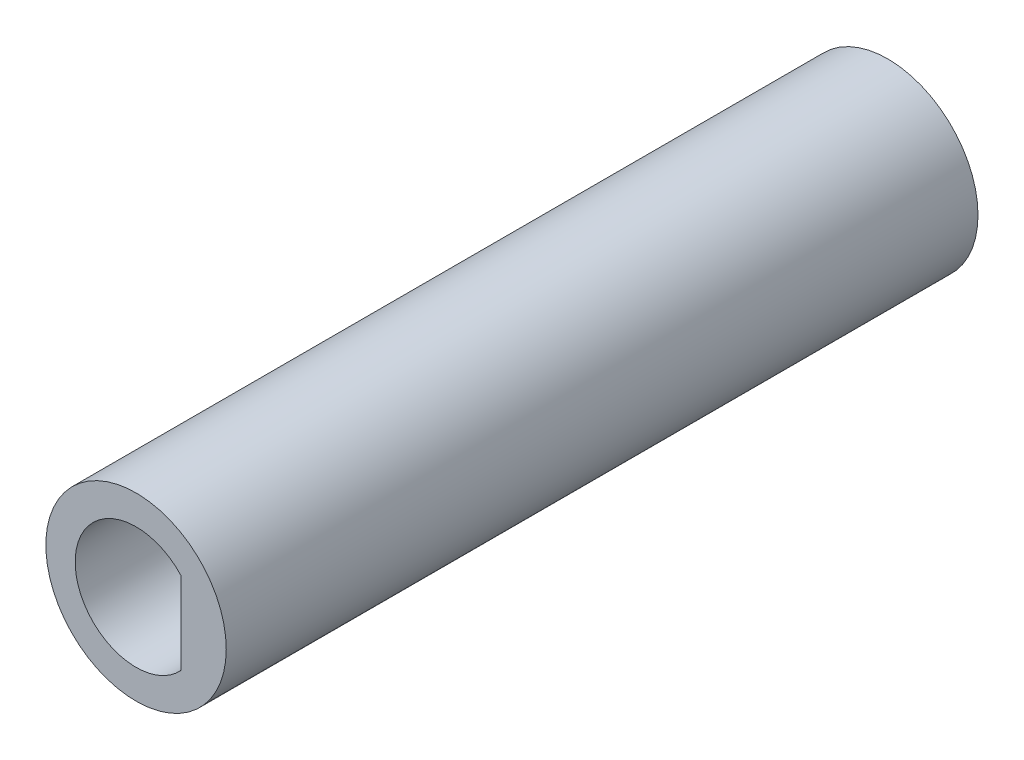
ISO-10303-21;
HEADER;
FILE_DESCRIPTION(('STEP AP214'),'2;1');
FILE_NAME('part.step','',(''),(''),'','','');
FILE_SCHEMA(('AUTOMOTIVE_DESIGN { 1 0 10303 214 1 1 1 1 }'));
ENDSEC;
DATA;
#1=APPLICATION_CONTEXT('core data for automotive mechanical design processes');
#2=APPLICATION_PROTOCOL_DEFINITION('international standard','automotive_design',2000,#1);
#3=PRODUCT_CONTEXT('',#1,'mechanical');
#4=PRODUCT('Part','Part','',(#3));
#5=PRODUCT_RELATED_PRODUCT_CATEGORY('part','',(#4));
#6=PRODUCT_DEFINITION_FORMATION('','',#4);
#7=PRODUCT_DEFINITION_CONTEXT('part definition',#1,'design');
#8=PRODUCT_DEFINITION('design','',#6,#7);
#9=PRODUCT_DEFINITION_SHAPE('','',#8);
#10=(LENGTH_UNIT() NAMED_UNIT(*) SI_UNIT(.MILLI.,.METRE.));
#11=(NAMED_UNIT(*) PLANE_ANGLE_UNIT() SI_UNIT($,.RADIAN.));
#12=(NAMED_UNIT(*) SI_UNIT($,.STERADIAN.) SOLID_ANGLE_UNIT());
#13=UNCERTAINTY_MEASURE_WITH_UNIT(LENGTH_MEASURE(1.E-05),#10,'distance_accuracy_value','');
#14=(GEOMETRIC_REPRESENTATION_CONTEXT(3) GLOBAL_UNCERTAINTY_ASSIGNED_CONTEXT((#13)) GLOBAL_UNIT_ASSIGNED_CONTEXT((#10,
#11,#12)) REPRESENTATION_CONTEXT('',''));
#15=CARTESIAN_POINT('',(0.,0.,0.));
#16=DIRECTION('',(0.,0.,1.));
#17=DIRECTION('',(1.,0.,0.));
#18=AXIS2_PLACEMENT_3D('',#15,#16,#17);
#19=CARTESIAN_POINT('',(0.,0.,15.));
#20=DIRECTION('',(0.,0.,1.));
#21=DIRECTION('',(1.,0.,0.));
#22=AXIS2_PLACEMENT_3D('',#19,#20,#21);
#23=PLANE('',#22);
#24=CARTESIAN_POINT('',(0.,0.,15.));
#25=DIRECTION('',(0.,0.,1.));
#26=DIRECTION('',(1.,0.,0.));
#27=AXIS2_PLACEMENT_3D('',#24,#25,#26);
#28=CIRCLE('',#27,6.);
#29=CARTESIAN_POINT('',(6.,0.,15.));
#30=VERTEX_POINT('',#29);
#31=EDGE_CURVE('E11',#30,#30,#28,.T.);
#32=ORIENTED_EDGE('',*,*,#31,.T.);
#33=EDGE_LOOP('',(#32));
#34=FACE_BOUND('',#33,.T.);
#35=DIRECTION('',(0.,1.,0.));
#36=VECTOR('',#35,1.);
#37=CARTESIAN_POINT('',(3.,2.72075357208256,15.));
#38=LINE('',#37,#36);
#39=CARTESIAN_POINT('',(3.,-2.72075357208256,15.));
#40=VERTEX_POINT('',#39);
#41=CARTESIAN_POINT('',(3.,2.72075357208256,15.));
#42=VERTEX_POINT('',#41);
#43=EDGE_CURVE('E63',#40,#42,#38,.T.);
#44=ORIENTED_EDGE('',*,*,#43,.F.);
#45=CARTESIAN_POINT('',(0.,0.,15.));
#46=DIRECTION('',(0.,0.,1.));
#47=DIRECTION('',(1.,0.,0.));
#48=AXIS2_PLACEMENT_3D('',#45,#46,#47);
#49=CIRCLE('',#48,4.05);
#50=EDGE_CURVE('E85',#42,#40,#49,.T.);
#51=ORIENTED_EDGE('',*,*,#50,.F.);
#52=EDGE_LOOP('',(#44,#51));
#53=FACE_BOUND('',#52,.T.);
#54=ADVANCED_FACE('F42',(#34,#53),#23,.T.);
#55=CARTESIAN_POINT('',(0.,0.,15.));
#56=DIRECTION('',(0.,0.,-1.));
#57=DIRECTION('',(-1.,0.,0.));
#58=AXIS2_PLACEMENT_3D('',#55,#56,#57);
#59=CYLINDRICAL_SURFACE('',#58,6.);
#60=ORIENTED_EDGE('',*,*,#31,.F.);
#61=EDGE_LOOP('',(#60));
#62=FACE_BOUND('',#61,.T.);
#63=CARTESIAN_POINT('',(0.,0.,-35.));
#64=DIRECTION('',(0.,0.,1.));
#65=DIRECTION('',(1.,0.,0.));
#66=AXIS2_PLACEMENT_3D('',#63,#64,#65);
#67=CIRCLE('',#66,6.);
#68=CARTESIAN_POINT('',(6.,0.,-35.));
#69=VERTEX_POINT('',#68);
#70=EDGE_CURVE('E81',#69,#69,#67,.T.);
#71=ORIENTED_EDGE('',*,*,#70,.T.);
#72=EDGE_LOOP('',(#71));
#73=FACE_BOUND('',#72,.T.);
#74=ADVANCED_FACE('F44',(#62,#73),#59,.T.);
#75=CARTESIAN_POINT('',(0.,0.,15.));
#76=DIRECTION('',(0.,0.,-1.));
#77=DIRECTION('',(-1.,0.,0.));
#78=AXIS2_PLACEMENT_3D('',#75,#76,#77);
#79=CYLINDRICAL_SURFACE('',#78,4.05);
#80=CARTESIAN_POINT('',(0.,0.,0.));
#81=DIRECTION('',(0.,0.,1.));
#82=DIRECTION('',(1.,0.,0.));
#83=AXIS2_PLACEMENT_3D('',#80,#81,#82);
#84=CIRCLE('',#83,4.05);
#85=CARTESIAN_POINT('',(3.,2.72075357208256,0.));
#86=VERTEX_POINT('',#85);
#87=CARTESIAN_POINT('',(3.,-2.72075357208256,0.));
#88=VERTEX_POINT('',#87);
#89=EDGE_CURVE('E77',#86,#88,#84,.T.);
#90=ORIENTED_EDGE('',*,*,#89,.F.);
#91=DIRECTION('',(0.,0.,-1.));
#92=VECTOR('',#91,1.);
#93=CARTESIAN_POINT('',(3.,2.72075357208256,15.));
#94=LINE('',#93,#92);
#95=EDGE_CURVE('E67',#42,#86,#94,.T.);
#96=ORIENTED_EDGE('',*,*,#95,.F.);
#97=ORIENTED_EDGE('',*,*,#50,.T.);
#98=DIRECTION('',(0.,0.,-1.));
#99=VECTOR('',#98,1.);
#100=CARTESIAN_POINT('',(3.,-2.72075357208256,15.));
#101=LINE('',#100,#99);
#102=EDGE_CURVE('E51',#40,#88,#101,.T.);
#103=ORIENTED_EDGE('',*,*,#102,.T.);
#104=EDGE_LOOP('',(#90,#96,#97,#103));
#105=FACE_BOUND('',#104,.T.);
#106=ADVANCED_FACE('F78',(#105),#79,.F.);
#107=CARTESIAN_POINT('',(3.,2.72075357208256,15.));
#108=DIRECTION('',(-1.,0.,0.));
#109=DIRECTION('',(0.,0.,1.));
#110=AXIS2_PLACEMENT_3D('',#107,#108,#109);
#111=PLANE('',#110);
#112=DIRECTION('',(0.,1.,0.));
#113=VECTOR('',#112,1.);
#114=CARTESIAN_POINT('',(3.,2.72075357208256,0.));
#115=LINE('',#114,#113);
#116=EDGE_CURVE('E71',#88,#86,#115,.T.);
#117=ORIENTED_EDGE('',*,*,#116,.F.);
#118=ORIENTED_EDGE('',*,*,#102,.F.);
#119=ORIENTED_EDGE('',*,*,#43,.T.);
#120=ORIENTED_EDGE('',*,*,#95,.T.);
#121=EDGE_LOOP('',(#117,#118,#119,#120));
#122=FACE_BOUND('',#121,.T.);
#123=ADVANCED_FACE('F69',(#122),#111,.T.);
#124=CARTESIAN_POINT('',(0.,0.,0.));
#125=DIRECTION('',(0.,0.,1.));
#126=DIRECTION('',(1.,0.,0.));
#127=AXIS2_PLACEMENT_3D('',#124,#125,#126);
#128=PLANE('',#127);
#129=ORIENTED_EDGE('',*,*,#116,.T.);
#130=ORIENTED_EDGE('',*,*,#89,.T.);
#131=EDGE_LOOP('',(#129,#130));
#132=FACE_BOUND('',#131,.T.);
#133=ADVANCED_FACE('F83',(#132),#128,.T.);
#134=CARTESIAN_POINT('',(0.,0.,-35.));
#135=DIRECTION('',(0.,0.,1.));
#136=DIRECTION('',(1.,0.,0.));
#137=AXIS2_PLACEMENT_3D('',#134,#135,#136);
#138=PLANE('',#137);
#139=ORIENTED_EDGE('',*,*,#70,.F.);
#140=EDGE_LOOP('',(#139));
#141=FACE_BOUND('',#140,.T.);
#142=ADVANCED_FACE('F98',(#141),#138,.F.);
#143=CLOSED_SHELL('',(#54,#74,#106,#123,#133,#142));
#144=MANIFOLD_SOLID_BREP('B2',#143);
#145=ADVANCED_BREP_SHAPE_REPRESENTATION('',(#18,#144),#14);
#146=SHAPE_DEFINITION_REPRESENTATION(#9,#145);
ENDSEC;
END-ISO-10303-21;
